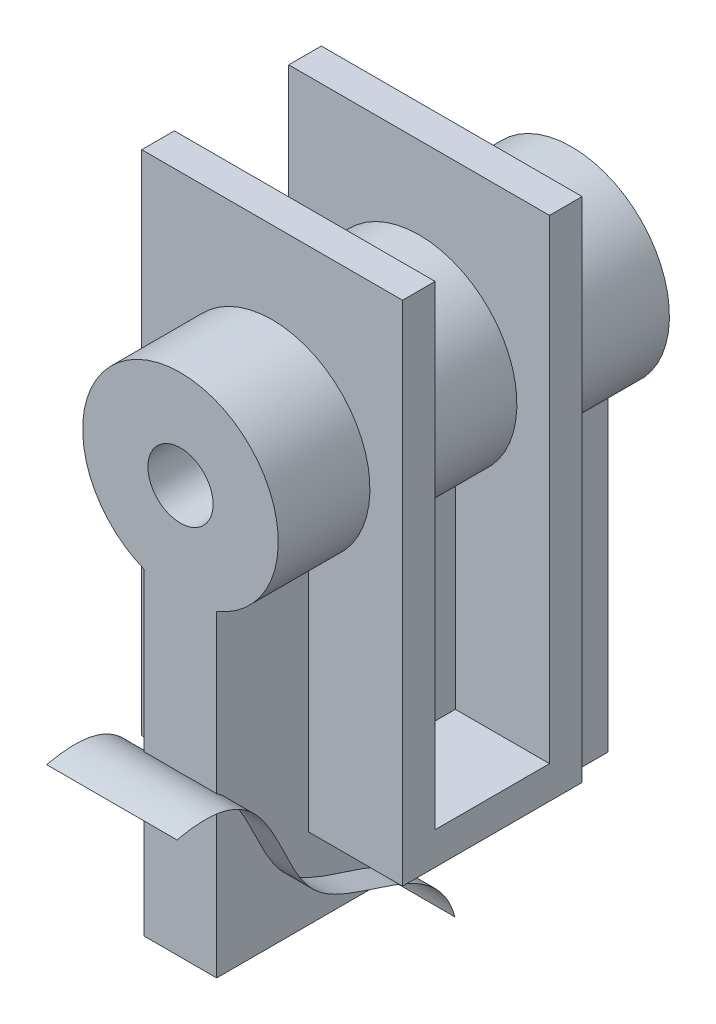
ISO-10303-21;
HEADER;
FILE_DESCRIPTION(('STEP AP214'),'2;1');
FILE_NAME('part.step','',(''),(''),'','','');
FILE_SCHEMA(('AUTOMOTIVE_DESIGN { 1 0 10303 214 1 1 1 1 }'));
ENDSEC;
DATA;
#1=APPLICATION_CONTEXT('core data for automotive mechanical design processes');
#2=APPLICATION_PROTOCOL_DEFINITION('international standard','automotive_design',2000,#1);
#3=PRODUCT_CONTEXT('',#1,'mechanical');
#4=PRODUCT('Part','Part','',(#3));
#5=PRODUCT_RELATED_PRODUCT_CATEGORY('part','',(#4));
#6=PRODUCT_DEFINITION_FORMATION('','',#4);
#7=PRODUCT_DEFINITION_CONTEXT('part definition',#1,'design');
#8=PRODUCT_DEFINITION('design','',#6,#7);
#9=PRODUCT_DEFINITION_SHAPE('','',#8);
#10=(LENGTH_UNIT() NAMED_UNIT(*) SI_UNIT(.MILLI.,.METRE.));
#11=(NAMED_UNIT(*) PLANE_ANGLE_UNIT() SI_UNIT($,.RADIAN.));
#12=(NAMED_UNIT(*) SI_UNIT($,.STERADIAN.) SOLID_ANGLE_UNIT());
#13=UNCERTAINTY_MEASURE_WITH_UNIT(LENGTH_MEASURE(1.E-05),#10,'distance_accuracy_value','');
#14=(GEOMETRIC_REPRESENTATION_CONTEXT(3) GLOBAL_UNCERTAINTY_ASSIGNED_CONTEXT((#13)) GLOBAL_UNIT_ASSIGNED_CONTEXT((#10,
#11,#12)) REPRESENTATION_CONTEXT('',''));
#15=CARTESIAN_POINT('',(0.,0.,0.));
#16=DIRECTION('',(0.,0.,1.));
#17=DIRECTION('',(1.,0.,0.));
#18=AXIS2_PLACEMENT_3D('',#15,#16,#17);
#19=CARTESIAN_POINT('',(0.,-36.8210870869659,40.5237731026121));
#20=CARTESIAN_POINT('',(0.,-33.3118553670702,25.1176072235687));
#21=CARTESIAN_POINT('',(0.,-61.7215890433346,26.7426652328646));
#22=CARTESIAN_POINT('',(0.,-57.8458147883083,0.702636395193637));
#23=CARTESIAN_POINT('',(0.,-68.3475748648418,-2.08737019533879));
#24=B_SPLINE_CURVE_WITH_KNOTS('',3,(#19,#20,#21,#22,#23),.UNSPECIFIED.,.F.,.F.,(4,1,4),(0.,
0.518621459530431,1.),.UNSPECIFIED.);
#25=DIRECTION('',(1.,0.,0.));
#26=VECTOR('',#25,1.);
#27=SURFACE_OF_LINEAR_EXTRUSION('',#24,#26);
#28=CARTESIAN_POINT('',(10.,-36.8210870869659,40.5237731026121));
#29=CARTESIAN_POINT('',(10.,-33.3118553670702,25.1176072235687));
#30=CARTESIAN_POINT('',(10.,-61.7215890433346,26.7426652328646));
#31=CARTESIAN_POINT('',(10.,-57.8458147883083,0.702636395193637));
#32=CARTESIAN_POINT('',(10.,-68.3475748648418,-2.08737019533879));
#33=B_SPLINE_CURVE_WITH_KNOTS('',3,(#28,#29,#30,#31,#32),.UNSPECIFIED.,.F.,.F.,(4,1,4),(0.,
0.518621459530431,1.),.UNSPECIFIED.);
#34=CARTESIAN_POINT('',(10.,-36.8210870869659,40.5237731026121));
#35=VERTEX_POINT('',#34);
#36=CARTESIAN_POINT('',(10.,-68.3475748648418,-2.08737019533879));
#37=VERTEX_POINT('',#36);
#38=EDGE_CURVE('E61',#35,#37,#33,.T.);
#39=ORIENTED_EDGE('',*,*,#38,.F.);
#40=DIRECTION('',(1.,0.,0.));
#41=VECTOR('',#40,1.);
#42=CARTESIAN_POINT('',(0.,-36.8210870869659,40.5237731026121));
#43=LINE('',#42,#41);
#44=CARTESIAN_POINT('',(-10.,-36.8210870869659,40.5237731026121));
#45=VERTEX_POINT('',#44);
#46=EDGE_CURVE('E53',#45,#35,#43,.T.);
#47=ORIENTED_EDGE('',*,*,#46,.F.);
#48=CARTESIAN_POINT('',(-10.,-36.8210870869659,40.5237731026121));
#49=CARTESIAN_POINT('',(-10.,-33.3118553670702,25.1176072235687));
#50=CARTESIAN_POINT('',(-10.,-61.7215890433346,26.7426652328646));
#51=CARTESIAN_POINT('',(-10.,-57.8458147883083,0.702636395193637));
#52=CARTESIAN_POINT('',(-10.,-68.3475748648418,-2.08737019533879));
#53=B_SPLINE_CURVE_WITH_KNOTS('',3,(#48,#49,#50,#51,#52),.UNSPECIFIED.,.F.,.F.,(4,1,4),(0.,
0.518621459530431,1.),.UNSPECIFIED.);
#54=CARTESIAN_POINT('',(-10.,-68.3475748648418,-2.08737019533879));
#55=VERTEX_POINT('',#54);
#56=EDGE_CURVE('E71',#45,#55,#53,.T.);
#57=ORIENTED_EDGE('',*,*,#56,.T.);
#58=DIRECTION('',(1.,0.,0.));
#59=VECTOR('',#58,1.);
#60=CARTESIAN_POINT('',(0.,-68.3475748648418,-2.08737019533879));
#61=LINE('',#60,#59);
#62=EDGE_CURVE('E12',#55,#37,#61,.T.);
#63=ORIENTED_EDGE('',*,*,#62,.T.);
#64=EDGE_LOOP('',(#39,#47,#57,#63));
#65=FACE_BOUND('',#64,.T.);
#66=ADVANCED_FACE('F51',(#65),#27,.T.);
#67=OPEN_SHELL('',(#66));
#68=SHELL_BASED_SURFACE_MODEL('B2',(#67));
#69=CARTESIAN_POINT('',(-20.,-45.2531458099855,-6.6055019568257));
#70=DIRECTION('',(0.,1.,0.));
#71=DIRECTION('',(0.,0.,1.));
#72=AXIS2_PLACEMENT_3D('',#69,#70,#71);
#73=PLANE('',#72);
#74=DIRECTION('',(1.,0.,0.));
#75=VECTOR('',#74,1.);
#76=CARTESIAN_POINT('',(-20.,-45.2531458099855,10.9381302617935));
#77=LINE('',#76,#75);
#78=CARTESIAN_POINT('',(-20.,-45.2531458099855,10.9381302617935));
#79=VERTEX_POINT('',#78);
#80=CARTESIAN_POINT('',(20.,-45.2531458099855,10.9381302617935));
#81=VERTEX_POINT('',#80);
#82=EDGE_CURVE('E123',#79,#81,#77,.T.);
#83=ORIENTED_EDGE('',*,*,#82,.T.);
#84=DIRECTION('',(0.,0.,1.));
#85=VECTOR('',#84,1.);
#86=CARTESIAN_POINT('',(20.,-45.2531458099855,-6.6055019568257));
#87=LINE('',#86,#85);
#88=CARTESIAN_POINT('',(20.,-45.2531458099855,-6.6055019568257));
#89=VERTEX_POINT('',#88);
#90=EDGE_CURVE('E184',#89,#81,#87,.T.);
#91=ORIENTED_EDGE('',*,*,#90,.F.);
#92=DIRECTION('',(1.,0.,0.));
#93=VECTOR('',#92,1.);
#94=CARTESIAN_POINT('',(-20.,-45.2531458099855,-6.6055019568257));
#95=LINE('',#94,#93);
#96=CARTESIAN_POINT('',(-20.,-45.2531458099855,-6.6055019568257));
#97=VERTEX_POINT('',#96);
#98=EDGE_CURVE('E49',#97,#89,#95,.T.);
#99=ORIENTED_EDGE('',*,*,#98,.F.);
#100=DIRECTION('',(0.,0.,1.));
#101=VECTOR('',#100,1.);
#102=CARTESIAN_POINT('',(-20.,-45.2531458099855,-6.6055019568257));
#103=LINE('',#102,#101);
#104=EDGE_CURVE('E185',#97,#79,#103,.T.);
#105=ORIENTED_EDGE('',*,*,#104,.T.);
#106=EDGE_LOOP('',(#83,#91,#99,#105));
#107=FACE_BOUND('',#106,.T.);
#108=ADVANCED_FACE('F120',(#107),#73,.T.);
#109=CARTESIAN_POINT('',(-20.,-45.2531458099855,-6.6055019568257));
#110=DIRECTION('',(0.,0.,1.));
#111=DIRECTION('',(1.,0.,0.));
#112=AXIS2_PLACEMENT_3D('',#109,#110,#111);
#113=PLANE('',#112);
#114=ORIENTED_EDGE('',*,*,#98,.T.);
#115=DIRECTION('',(0.,-1.,0.));
#116=VECTOR('',#115,1.);
#117=CARTESIAN_POINT('',(20.,-45.2531458099855,-6.6055019568257));
#118=LINE('',#117,#116);
#119=CARTESIAN_POINT('',(20.,27.5804653060911,-6.6055019568257));
#120=VERTEX_POINT('',#119);
#121=EDGE_CURVE('E202',#120,#89,#118,.T.);
#122=ORIENTED_EDGE('',*,*,#121,.F.);
#123=DIRECTION('',(1.,0.,0.));
#124=VECTOR('',#123,1.);
#125=CARTESIAN_POINT('',(-20.,27.5804653060911,-6.6055019568257));
#126=LINE('',#125,#124);
#127=CARTESIAN_POINT('',(-20.,27.5804653060911,-6.6055019568257));
#128=VERTEX_POINT('',#127);
#129=EDGE_CURVE('E128',#128,#120,#126,.T.);
#130=ORIENTED_EDGE('',*,*,#129,.F.);
#131=DIRECTION('',(0.,-1.,0.));
#132=VECTOR('',#131,1.);
#133=CARTESIAN_POINT('',(-20.,-45.2531458099855,-6.6055019568257));
#134=LINE('',#133,#132);
#135=EDGE_CURVE('E190',#128,#97,#134,.T.);
#136=ORIENTED_EDGE('',*,*,#135,.T.);
#137=EDGE_LOOP('',(#114,#122,#130,#136));
#138=FACE_BOUND('',#137,.T.);
#139=ADVANCED_FACE('F266',(#138),#113,.T.);
#140=CARTESIAN_POINT('',(-20.,27.5804653060911,-6.6055019568257));
#141=DIRECTION('',(0.,1.,0.));
#142=DIRECTION('',(0.,0.,1.));
#143=AXIS2_PLACEMENT_3D('',#140,#141,#142);
#144=PLANE('',#143);
#145=ORIENTED_EDGE('',*,*,#129,.T.);
#146=DIRECTION('',(0.,0.,1.));
#147=VECTOR('',#146,1.);
#148=CARTESIAN_POINT('',(20.,27.5804653060911,-6.6055019568257));
#149=LINE('',#148,#147);
#150=CARTESIAN_POINT('',(20.,27.5804653060911,-11.6055019568257));
#151=VERTEX_POINT('',#150);
#152=EDGE_CURVE('E215',#151,#120,#149,.T.);
#153=ORIENTED_EDGE('',*,*,#152,.F.);
#154=DIRECTION('',(1.,0.,0.));
#155=VECTOR('',#154,1.);
#156=CARTESIAN_POINT('',(-20.,27.5804653060911,-11.6055019568257));
#157=LINE('',#156,#155);
#158=CARTESIAN_POINT('',(-20.,27.5804653060911,-11.6055019568257));
#159=VERTEX_POINT('',#158);
#160=EDGE_CURVE('E237',#159,#151,#157,.T.);
#161=ORIENTED_EDGE('',*,*,#160,.F.);
#162=DIRECTION('',(0.,0.,1.));
#163=VECTOR('',#162,1.);
#164=CARTESIAN_POINT('',(-20.,27.5804653060911,-6.6055019568257));
#165=LINE('',#164,#163);
#166=EDGE_CURVE('E233',#159,#128,#165,.T.);
#167=ORIENTED_EDGE('',*,*,#166,.T.);
#168=EDGE_LOOP('',(#145,#153,#161,#167));
#169=FACE_BOUND('',#168,.T.);
#170=ADVANCED_FACE('F265',(#169),#144,.T.);
#171=CARTESIAN_POINT('',(-20.,-50.2531458099855,-11.6055019568257));
#172=DIRECTION('',(0.,0.,-1.));
#173=DIRECTION('',(-1.,0.,0.));
#174=AXIS2_PLACEMENT_3D('',#171,#172,#173);
#175=PLANE('',#174);
#176=ORIENTED_EDGE('',*,*,#160,.T.);
#177=DIRECTION('',(0.,1.,0.));
#178=VECTOR('',#177,1.);
#179=CARTESIAN_POINT('',(20.,-50.2531458099855,-11.6055019568257));
#180=LINE('',#179,#178);
#181=CARTESIAN_POINT('',(20.,-50.2531458099855,-11.6055019568257));
#182=VERTEX_POINT('',#181);
#183=EDGE_CURVE('E212',#182,#151,#180,.T.);
#184=ORIENTED_EDGE('',*,*,#183,.F.);
#185=DIRECTION('',(1.,0.,0.));
#186=VECTOR('',#185,1.);
#187=CARTESIAN_POINT('',(-20.,-50.2531458099855,-11.6055019568257));
#188=LINE('',#187,#186);
#189=CARTESIAN_POINT('',(-20.,-50.2531458099855,-11.6055019568257));
#190=VERTEX_POINT('',#189);
#191=EDGE_CURVE('E239',#190,#182,#188,.T.);
#192=ORIENTED_EDGE('',*,*,#191,.F.);
#193=DIRECTION('',(0.,1.,0.));
#194=VECTOR('',#193,1.);
#195=CARTESIAN_POINT('',(-20.,-50.2531458099855,-11.6055019568257));
#196=LINE('',#195,#194);
#197=EDGE_CURVE('E230',#190,#159,#196,.T.);
#198=ORIENTED_EDGE('',*,*,#197,.T.);
#199=EDGE_LOOP('',(#176,#184,#192,#198));
#200=FACE_BOUND('',#199,.T.);
#201=ADVANCED_FACE('F261',(#200),#175,.T.);
#202=CARTESIAN_POINT('',(-20.,-50.2531458099855,-11.6055019568257));
#203=DIRECTION('',(0.,-1.,0.));
#204=DIRECTION('',(0.,0.,-1.));
#205=AXIS2_PLACEMENT_3D('',#202,#203,#204);
#206=PLANE('',#205);
#207=ORIENTED_EDGE('',*,*,#191,.T.);
#208=DIRECTION('',(0.,0.,-1.));
#209=VECTOR('',#208,1.);
#210=CARTESIAN_POINT('',(20.,-50.2531458099855,-11.6055019568257));
#211=LINE('',#210,#209);
#212=CARTESIAN_POINT('',(20.,-50.2531458099855,15.9381302617935));
#213=VERTEX_POINT('',#212);
#214=EDGE_CURVE('E209',#213,#182,#211,.T.);
#215=ORIENTED_EDGE('',*,*,#214,.F.);
#216=DIRECTION('',(1.,0.,0.));
#217=VECTOR('',#216,1.);
#218=CARTESIAN_POINT('',(-20.,-50.2531458099855,15.9381302617935));
#219=LINE('',#218,#217);
#220=CARTESIAN_POINT('',(-20.,-50.2531458099855,15.9381302617935));
#221=VERTEX_POINT('',#220);
#222=EDGE_CURVE('E241',#221,#213,#219,.T.);
#223=ORIENTED_EDGE('',*,*,#222,.F.);
#224=DIRECTION('',(0.,0.,-1.));
#225=VECTOR('',#224,1.);
#226=CARTESIAN_POINT('',(-20.,-50.2531458099855,-11.6055019568257));
#227=LINE('',#226,#225);
#228=EDGE_CURVE('E227',#221,#190,#227,.T.);
#229=ORIENTED_EDGE('',*,*,#228,.T.);
#230=EDGE_LOOP('',(#207,#215,#223,#229));
#231=FACE_BOUND('',#230,.T.);
#232=ADVANCED_FACE('F254',(#231),#206,.T.);
#233=CARTESIAN_POINT('',(-20.,-50.2531458099855,15.9381302617935));
#234=DIRECTION('',(0.,0.,1.));
#235=DIRECTION('',(1.,0.,0.));
#236=AXIS2_PLACEMENT_3D('',#233,#234,#235);
#237=PLANE('',#236);
#238=ORIENTED_EDGE('',*,*,#222,.T.);
#239=DIRECTION('',(0.,-1.,0.));
#240=VECTOR('',#239,1.);
#241=CARTESIAN_POINT('',(20.,-50.2531458099855,15.9381302617935));
#242=LINE('',#241,#240);
#243=CARTESIAN_POINT('',(20.,27.5804653060911,15.9381302617935));
#244=VERTEX_POINT('',#243);
#245=EDGE_CURVE('E206',#244,#213,#242,.T.);
#246=ORIENTED_EDGE('',*,*,#245,.F.);
#247=DIRECTION('',(1.,0.,0.));
#248=VECTOR('',#247,1.);
#249=CARTESIAN_POINT('',(-20.,27.5804653060911,15.9381302617935));
#250=LINE('',#249,#248);
#251=CARTESIAN_POINT('',(-20.,27.5804653060911,15.9381302617935));
#252=VERTEX_POINT('',#251);
#253=EDGE_CURVE('E243',#252,#244,#250,.T.);
#254=ORIENTED_EDGE('',*,*,#253,.F.);
#255=DIRECTION('',(0.,-1.,0.));
#256=VECTOR('',#255,1.);
#257=CARTESIAN_POINT('',(-20.,-50.2531458099855,15.9381302617935));
#258=LINE('',#257,#256);
#259=EDGE_CURVE('E224',#252,#221,#258,.T.);
#260=ORIENTED_EDGE('',*,*,#259,.T.);
#261=EDGE_LOOP('',(#238,#246,#254,#260));
#262=FACE_BOUND('',#261,.T.);
#263=ADVANCED_FACE('F251',(#262),#237,.T.);
#264=CARTESIAN_POINT('',(-20.,27.5804653060911,15.9381302617935));
#265=DIRECTION('',(0.,1.,0.));
#266=DIRECTION('',(0.,0.,1.));
#267=AXIS2_PLACEMENT_3D('',#264,#265,#266);
#268=PLANE('',#267);
#269=ORIENTED_EDGE('',*,*,#253,.T.);
#270=DIRECTION('',(0.,0.,1.));
#271=VECTOR('',#270,1.);
#272=CARTESIAN_POINT('',(20.,27.5804653060911,15.9381302617935));
#273=LINE('',#272,#271);
#274=CARTESIAN_POINT('',(20.,27.5804653060911,10.9381302617935));
#275=VERTEX_POINT('',#274);
#276=EDGE_CURVE('E197',#275,#244,#273,.T.);
#277=ORIENTED_EDGE('',*,*,#276,.F.);
#278=DIRECTION('',(1.,0.,0.));
#279=VECTOR('',#278,1.);
#280=CARTESIAN_POINT('',(-20.,27.5804653060911,10.9381302617935));
#281=LINE('',#280,#279);
#282=CARTESIAN_POINT('',(-20.,27.5804653060911,10.9381302617935));
#283=VERTEX_POINT('',#282);
#284=EDGE_CURVE('E189',#283,#275,#281,.T.);
#285=ORIENTED_EDGE('',*,*,#284,.F.);
#286=DIRECTION('',(0.,0.,1.));
#287=VECTOR('',#286,1.);
#288=CARTESIAN_POINT('',(-20.,27.5804653060911,15.9381302617935));
#289=LINE('',#288,#287);
#290=EDGE_CURVE('E221',#283,#252,#289,.T.);
#291=ORIENTED_EDGE('',*,*,#290,.T.);
#292=EDGE_LOOP('',(#269,#277,#285,#291));
#293=FACE_BOUND('',#292,.T.);
#294=ADVANCED_FACE('F245',(#293),#268,.T.);
#295=CARTESIAN_POINT('',(-20.,-45.2531458099855,10.9381302617935));
#296=DIRECTION('',(0.,0.,-1.));
#297=DIRECTION('',(-1.,0.,0.));
#298=AXIS2_PLACEMENT_3D('',#295,#296,#297);
#299=PLANE('',#298);
#300=ORIENTED_EDGE('',*,*,#284,.T.);
#301=DIRECTION('',(0.,1.,0.));
#302=VECTOR('',#301,1.);
#303=CARTESIAN_POINT('',(20.,-45.2531458099855,10.9381302617935));
#304=LINE('',#303,#302);
#305=EDGE_CURVE('E192',#81,#275,#304,.T.);
#306=ORIENTED_EDGE('',*,*,#305,.F.);
#307=ORIENTED_EDGE('',*,*,#82,.F.);
#308=DIRECTION('',(0.,1.,0.));
#309=VECTOR('',#308,1.);
#310=CARTESIAN_POINT('',(-20.,-45.2531458099855,10.9381302617935));
#311=LINE('',#310,#309);
#312=EDGE_CURVE('E219',#79,#283,#311,.T.);
#313=ORIENTED_EDGE('',*,*,#312,.T.);
#314=EDGE_LOOP('',(#300,#306,#307,#313));
#315=FACE_BOUND('',#314,.T.);
#316=ADVANCED_FACE('F193',(#315),#299,.T.);
#317=CARTESIAN_POINT('',(-20.,0.,-70.));
#318=DIRECTION('',(-1.,0.,0.));
#319=DIRECTION('',(0.,0.,1.));
#320=AXIS2_PLACEMENT_3D('',#317,#318,#319);
#321=PLANE('',#320);
#322=ORIENTED_EDGE('',*,*,#104,.F.);
#323=ORIENTED_EDGE('',*,*,#135,.F.);
#324=ORIENTED_EDGE('',*,*,#166,.F.);
#325=ORIENTED_EDGE('',*,*,#197,.F.);
#326=ORIENTED_EDGE('',*,*,#228,.F.);
#327=ORIENTED_EDGE('',*,*,#259,.F.);
#328=ORIENTED_EDGE('',*,*,#290,.F.);
#329=ORIENTED_EDGE('',*,*,#312,.F.);
#330=EDGE_LOOP('',(#322,#323,#324,#325,#326,#327,#328,#329));
#331=FACE_BOUND('',#330,.T.);
#332=ADVANCED_FACE('F257',(#331),#321,.T.);
#333=CARTESIAN_POINT('',(20.,0.,-70.));
#334=DIRECTION('',(-1.,0.,0.));
#335=DIRECTION('',(0.,0.,1.));
#336=AXIS2_PLACEMENT_3D('',#333,#334,#335);
#337=PLANE('',#336);
#338=ORIENTED_EDGE('',*,*,#90,.T.);
#339=ORIENTED_EDGE('',*,*,#305,.T.);
#340=ORIENTED_EDGE('',*,*,#276,.T.);
#341=ORIENTED_EDGE('',*,*,#245,.T.);
#342=ORIENTED_EDGE('',*,*,#214,.T.);
#343=ORIENTED_EDGE('',*,*,#183,.T.);
#344=ORIENTED_EDGE('',*,*,#152,.T.);
#345=ORIENTED_EDGE('',*,*,#121,.T.);
#346=EDGE_LOOP('',(#338,#339,#340,#341,#342,#343,#344,#345));
#347=FACE_BOUND('',#346,.T.);
#348=ADVANCED_FACE('F200',(#347),#337,.F.);
#349=CLOSED_SHELL('',(#108,#139,#170,#201,#232,#263,#294,#316,#332,#348));
#350=MANIFOLD_SOLID_BREP('B6',#349);
#351=CARTESIAN_POINT('',(0.,0.,-30.));
#352=DIRECTION('',(0.,0.,1.));
#353=DIRECTION('',(1.,0.,0.));
#354=AXIS2_PLACEMENT_3D('',#351,#352,#353);
#355=CYLINDRICAL_SURFACE('',#354,15.);
#356=DIRECTION('',(0.,0.,1.));
#357=VECTOR('',#356,1.);
#358=CARTESIAN_POINT('',(-5.5576064521285,-13.9324445279089,-30.));
#359=LINE('',#358,#357);
#360=CARTESIAN_POINT('',(-5.5576064521285,-13.9324445279089,-30.));
#361=VERTEX_POINT('',#360);
#362=CARTESIAN_POINT('',(-5.5576064521285,-13.9324445279089,30.));
#363=VERTEX_POINT('',#362);
#364=EDGE_CURVE('E350',#361,#363,#359,.T.);
#365=ORIENTED_EDGE('',*,*,#364,.T.);
#366=CARTESIAN_POINT('',(0.,0.,30.));
#367=DIRECTION('',(0.,0.,1.));
#368=DIRECTION('',(1.,0.,0.));
#369=AXIS2_PLACEMENT_3D('',#366,#367,#368);
#370=CIRCLE('',#369,15.);
#371=CARTESIAN_POINT('',(5.5576064521285,-13.9324445279089,30.));
#372=VERTEX_POINT('',#371);
#373=EDGE_CURVE('E387',#372,#363,#370,.T.);
#374=ORIENTED_EDGE('',*,*,#373,.F.);
#375=DIRECTION('',(0.,0.,1.));
#376=VECTOR('',#375,1.);
#377=CARTESIAN_POINT('',(5.5576064521285,-13.9324445279089,-30.));
#378=LINE('',#377,#376);
#379=CARTESIAN_POINT('',(5.5576064521285,-13.9324445279089,-30.));
#380=VERTEX_POINT('',#379);
#381=EDGE_CURVE('E118',#380,#372,#378,.T.);
#382=ORIENTED_EDGE('',*,*,#381,.F.);
#383=CARTESIAN_POINT('',(0.,0.,-30.));
#384=DIRECTION('',(0.,0.,1.));
#385=DIRECTION('',(1.,0.,0.));
#386=AXIS2_PLACEMENT_3D('',#383,#384,#385);
#387=CIRCLE('',#386,15.);
#388=EDGE_CURVE('E388',#380,#361,#387,.T.);
#389=ORIENTED_EDGE('',*,*,#388,.T.);
#390=EDGE_LOOP('',(#365,#374,#382,#389));
#391=FACE_BOUND('',#390,.T.);
#392=ADVANCED_FACE('F347',(#391),#355,.T.);
#393=CARTESIAN_POINT('',(5.5576064521285,-13.9324445279089,-30.));
#394=DIRECTION('',(1.,0.,0.));
#395=DIRECTION('',(0.,1.,0.));
#396=AXIS2_PLACEMENT_3D('',#393,#394,#395);
#397=PLANE('',#396);
#398=ORIENTED_EDGE('',*,*,#381,.T.);
#399=DIRECTION('',(0.,1.,0.));
#400=VECTOR('',#399,1.);
#401=CARTESIAN_POINT('',(5.5576064521285,-13.9324445279089,30.));
#402=LINE('',#401,#400);
#403=CARTESIAN_POINT('',(5.5576064521285,-62.6422800075539,30.));
#404=VERTEX_POINT('',#403);
#405=EDGE_CURVE('E405',#404,#372,#402,.T.);
#406=ORIENTED_EDGE('',*,*,#405,.F.);
#407=DIRECTION('',(0.,0.,1.));
#408=VECTOR('',#407,1.);
#409=CARTESIAN_POINT('',(5.5576064521285,-62.6422800075539,-30.));
#410=LINE('',#409,#408);
#411=CARTESIAN_POINT('',(5.5576064521285,-62.6422800075539,-30.));
#412=VERTEX_POINT('',#411);
#413=EDGE_CURVE('E355',#412,#404,#410,.T.);
#414=ORIENTED_EDGE('',*,*,#413,.F.);
#415=DIRECTION('',(0.,1.,0.));
#416=VECTOR('',#415,1.);
#417=CARTESIAN_POINT('',(5.5576064521285,-13.9324445279089,-30.));
#418=LINE('',#417,#416);
#419=EDGE_CURVE('E393',#412,#380,#418,.T.);
#420=ORIENTED_EDGE('',*,*,#419,.T.);
#421=EDGE_LOOP('',(#398,#406,#414,#420));
#422=FACE_BOUND('',#421,.T.);
#423=ADVANCED_FACE('F426',(#422),#397,.T.);
#424=CARTESIAN_POINT('',(-5.5576064521285,-62.6422800075539,-30.));
#425=DIRECTION('',(0.,-1.,0.));
#426=DIRECTION('',(0.,0.,-1.));
#427=AXIS2_PLACEMENT_3D('',#424,#425,#426);
#428=PLANE('',#427);
#429=ORIENTED_EDGE('',*,*,#413,.T.);
#430=DIRECTION('',(1.,0.,0.));
#431=VECTOR('',#430,1.);
#432=CARTESIAN_POINT('',(-5.5576064521285,-62.6422800075539,30.));
#433=LINE('',#432,#431);
#434=CARTESIAN_POINT('',(-5.5576064521285,-62.6422800075539,30.));
#435=VERTEX_POINT('',#434);
#436=EDGE_CURVE('E400',#435,#404,#433,.T.);
#437=ORIENTED_EDGE('',*,*,#436,.F.);
#438=DIRECTION('',(0.,0.,1.));
#439=VECTOR('',#438,1.);
#440=CARTESIAN_POINT('',(-5.5576064521285,-62.6422800075539,-30.));
#441=LINE('',#440,#439);
#442=CARTESIAN_POINT('',(-5.5576064521285,-62.6422800075539,-30.));
#443=VERTEX_POINT('',#442);
#444=EDGE_CURVE('E392',#443,#435,#441,.T.);
#445=ORIENTED_EDGE('',*,*,#444,.F.);
#446=DIRECTION('',(1.,0.,0.));
#447=VECTOR('',#446,1.);
#448=CARTESIAN_POINT('',(-5.5576064521285,-62.6422800075539,-30.));
#449=LINE('',#448,#447);
#450=EDGE_CURVE('E419',#443,#412,#449,.T.);
#451=ORIENTED_EDGE('',*,*,#450,.T.);
#452=EDGE_LOOP('',(#429,#437,#445,#451));
#453=FACE_BOUND('',#452,.T.);
#454=ADVANCED_FACE('F423',(#453),#428,.T.);
#455=CARTESIAN_POINT('',(-5.5576064521285,-13.9324445279089,-30.));
#456=DIRECTION('',(-1.,0.,0.));
#457=DIRECTION('',(0.,0.,1.));
#458=AXIS2_PLACEMENT_3D('',#455,#456,#457);
#459=PLANE('',#458);
#460=ORIENTED_EDGE('',*,*,#444,.T.);
#461=DIRECTION('',(0.,-1.,0.));
#462=VECTOR('',#461,1.);
#463=CARTESIAN_POINT('',(-5.5576064521285,-13.9324445279089,30.));
#464=LINE('',#463,#462);
#465=EDGE_CURVE('E395',#363,#435,#464,.T.);
#466=ORIENTED_EDGE('',*,*,#465,.F.);
#467=ORIENTED_EDGE('',*,*,#364,.F.);
#468=DIRECTION('',(0.,-1.,0.));
#469=VECTOR('',#468,1.);
#470=CARTESIAN_POINT('',(-5.5576064521285,-13.9324445279089,-30.));
#471=LINE('',#470,#469);
#472=EDGE_CURVE('E417',#361,#443,#471,.T.);
#473=ORIENTED_EDGE('',*,*,#472,.T.);
#474=EDGE_LOOP('',(#460,#466,#467,#473));
#475=FACE_BOUND('',#474,.T.);
#476=ADVANCED_FACE('F396',(#475),#459,.T.);
#477=CARTESIAN_POINT('',(0.,0.,-30.));
#478=DIRECTION('',(0.,0.,1.));
#479=DIRECTION('',(1.,0.,0.));
#480=AXIS2_PLACEMENT_3D('',#477,#478,#479);
#481=PLANE('',#480);
#482=CARTESIAN_POINT('',(0.,0.,-30.));
#483=DIRECTION('',(0.,0.,1.));
#484=DIRECTION('',(1.,0.,0.));
#485=AXIS2_PLACEMENT_3D('',#482,#483,#484);
#486=CIRCLE('',#485,5.);
#487=CARTESIAN_POINT('',(5.,0.,-30.));
#488=VERTEX_POINT('',#487);
#489=EDGE_CURVE('E413',#488,#488,#486,.T.);
#490=ORIENTED_EDGE('',*,*,#489,.T.);
#491=EDGE_LOOP('',(#490));
#492=FACE_BOUND('',#491,.T.);
#493=ORIENTED_EDGE('',*,*,#388,.F.);
#494=ORIENTED_EDGE('',*,*,#419,.F.);
#495=ORIENTED_EDGE('',*,*,#450,.F.);
#496=ORIENTED_EDGE('',*,*,#472,.F.);
#497=EDGE_LOOP('',(#493,#494,#495,#496));
#498=FACE_BOUND('',#497,.T.);
#499=ADVANCED_FACE('F428',(#492,#498),#481,.F.);
#500=CARTESIAN_POINT('',(0.,0.,-30.));
#501=DIRECTION('',(0.,0.,1.));
#502=DIRECTION('',(1.,0.,0.));
#503=AXIS2_PLACEMENT_3D('',#500,#501,#502);
#504=CYLINDRICAL_SURFACE('',#503,5.);
#505=ORIENTED_EDGE('',*,*,#489,.F.);
#506=EDGE_LOOP('',(#505));
#507=FACE_BOUND('',#506,.T.);
#508=CARTESIAN_POINT('',(0.,0.,30.));
#509=DIRECTION('',(0.,0.,1.));
#510=DIRECTION('',(1.,0.,0.));
#511=AXIS2_PLACEMENT_3D('',#508,#509,#510);
#512=CIRCLE('',#511,5.);
#513=CARTESIAN_POINT('',(5.,0.,30.));
#514=VERTEX_POINT('',#513);
#515=EDGE_CURVE('E406',#514,#514,#512,.T.);
#516=ORIENTED_EDGE('',*,*,#515,.T.);
#517=EDGE_LOOP('',(#516));
#518=FACE_BOUND('',#517,.T.);
#519=ADVANCED_FACE('F430',(#507,#518),#504,.F.);
#520=CARTESIAN_POINT('',(0.,0.,30.));
#521=DIRECTION('',(0.,0.,1.));
#522=DIRECTION('',(1.,0.,0.));
#523=AXIS2_PLACEMENT_3D('',#520,#521,#522);
#524=PLANE('',#523);
#525=ORIENTED_EDGE('',*,*,#373,.T.);
#526=ORIENTED_EDGE('',*,*,#465,.T.);
#527=ORIENTED_EDGE('',*,*,#436,.T.);
#528=ORIENTED_EDGE('',*,*,#405,.T.);
#529=EDGE_LOOP('',(#525,#526,#527,#528));
#530=FACE_BOUND('',#529,.T.);
#531=ORIENTED_EDGE('',*,*,#515,.F.);
#532=EDGE_LOOP('',(#531));
#533=FACE_BOUND('',#532,.T.);
#534=ADVANCED_FACE('F403',(#530,#533),#524,.T.);
#535=CLOSED_SHELL('',(#392,#423,#454,#476,#499,#519,#534));
#536=MANIFOLD_SOLID_BREP('B43',#535);
#537=ADVANCED_BREP_SHAPE_REPRESENTATION('',(#18,#350,#536),#14);
#538=MANIFOLD_SURFACE_SHAPE_REPRESENTATION('',(#18,#68),#14);
#539=SHAPE_REPRESENTATION('',(#18),#14);
#540=SHAPE_DEFINITION_REPRESENTATION(#9,#539);
#541=SHAPE_REPRESENTATION_RELATIONSHIP('','',#539,#537);
#542=SHAPE_REPRESENTATION_RELATIONSHIP('','',#539,#538);
ENDSEC;
END-ISO-10303-21;
